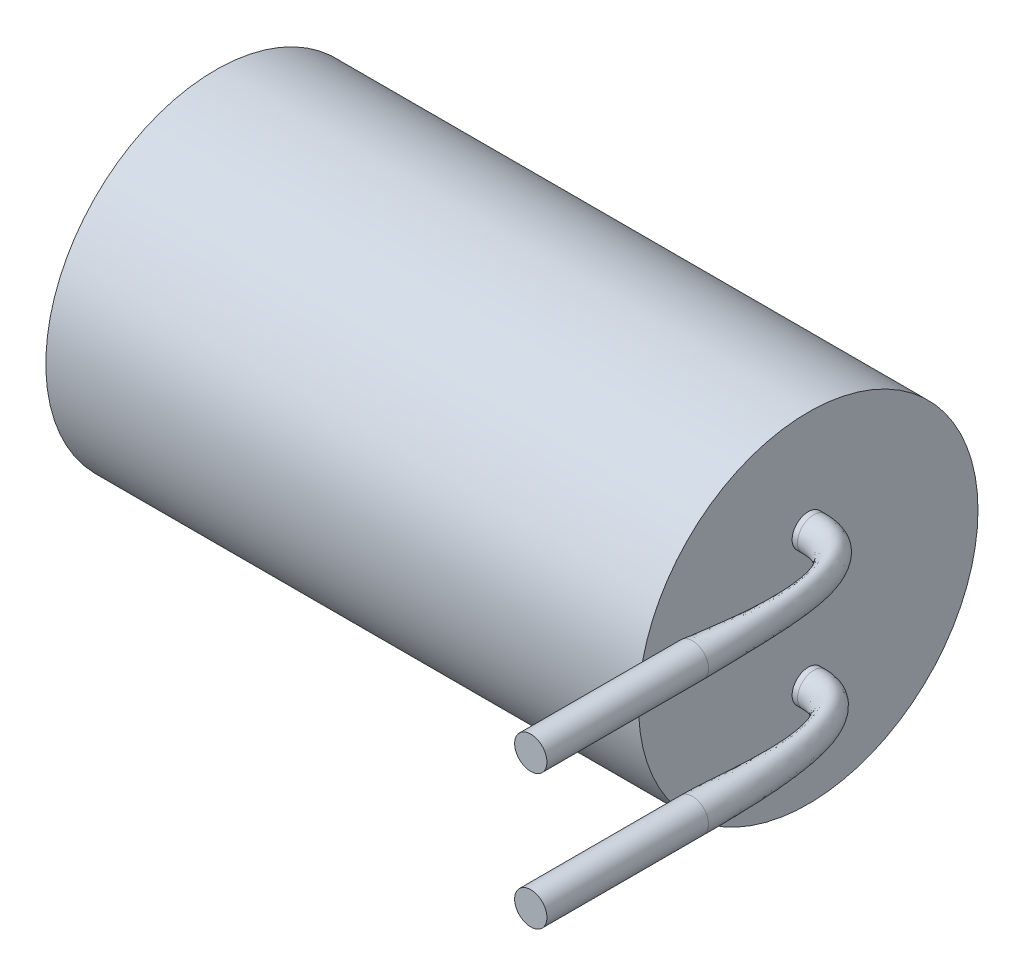
ISO-10303-21;
HEADER;
FILE_DESCRIPTION(('STEP AP214'),'2;1');
FILE_NAME('part.step','',(''),(''),'','','');
FILE_SCHEMA(('AUTOMOTIVE_DESIGN { 1 0 10303 214 1 1 1 1 }'));
ENDSEC;
DATA;
#1=APPLICATION_CONTEXT('core data for automotive mechanical design processes');
#2=APPLICATION_PROTOCOL_DEFINITION('international standard','automotive_design',2000,#1);
#3=PRODUCT_CONTEXT('',#1,'mechanical');
#4=PRODUCT('Part','Part','',(#3));
#5=PRODUCT_RELATED_PRODUCT_CATEGORY('part','',(#4));
#6=PRODUCT_DEFINITION_FORMATION('','',#4);
#7=PRODUCT_DEFINITION_CONTEXT('part definition',#1,'design');
#8=PRODUCT_DEFINITION('design','',#6,#7);
#9=PRODUCT_DEFINITION_SHAPE('','',#8);
#10=(LENGTH_UNIT() NAMED_UNIT(*) SI_UNIT(.MILLI.,.METRE.));
#11=(NAMED_UNIT(*) PLANE_ANGLE_UNIT() SI_UNIT($,.RADIAN.));
#12=(NAMED_UNIT(*) SI_UNIT($,.STERADIAN.) SOLID_ANGLE_UNIT());
#13=UNCERTAINTY_MEASURE_WITH_UNIT(LENGTH_MEASURE(1.E-05),#10,'distance_accuracy_value','');
#14=(GEOMETRIC_REPRESENTATION_CONTEXT(3) GLOBAL_UNCERTAINTY_ASSIGNED_CONTEXT((#13)) GLOBAL_UNIT_ASSIGNED_CONTEXT((#10,
#11,#12)) REPRESENTATION_CONTEXT('',''));
#15=CARTESIAN_POINT('',(0.,0.,0.));
#16=DIRECTION('',(0.,0.,1.));
#17=DIRECTION('',(1.,0.,0.));
#18=AXIS2_PLACEMENT_3D('',#15,#16,#17);
#19=CARTESIAN_POINT('',(1.,-1.25,3.));
#20=DIRECTION('',(0.,0.,-1.));
#21=DIRECTION('',(-1.,0.,0.));
#22=AXIS2_PLACEMENT_3D('',#19,#20,#21);
#23=CYLINDRICAL_SURFACE('',#22,0.3);
#24=CARTESIAN_POINT('',(1.,-1.25,3.));
#25=DIRECTION('',(0.,0.,1.));
#26=DIRECTION('',(1.,0.,0.));
#27=AXIS2_PLACEMENT_3D('',#24,#25,#26);
#28=CIRCLE('',#27,0.3);
#29=CARTESIAN_POINT('',(1.3,-1.25,3.));
#30=VERTEX_POINT('',#29);
#31=EDGE_CURVE('E11',#30,#30,#28,.T.);
#32=ORIENTED_EDGE('',*,*,#31,.F.);
#33=EDGE_LOOP('',(#32));
#34=FACE_BOUND('',#33,.T.);
#35=CARTESIAN_POINT('',(1.,-1.25,0.));
#36=DIRECTION('',(0.,0.,1.));
#37=DIRECTION('',(1.,0.,0.));
#38=AXIS2_PLACEMENT_3D('',#35,#36,#37);
#39=CIRCLE('',#38,0.3);
#40=CARTESIAN_POINT('',(1.3,-1.25,0.));
#41=VERTEX_POINT('',#40);
#42=EDGE_CURVE('E107',#41,#41,#39,.T.);
#43=ORIENTED_EDGE('',*,*,#42,.T.);
#44=EDGE_LOOP('',(#43));
#45=FACE_BOUND('',#44,.T.);
#46=ADVANCED_FACE('F98',(#34,#45),#23,.T.);
#47=CARTESIAN_POINT('',(1.,-1.25,3.));
#48=DIRECTION('',(0.,0.,1.));
#49=DIRECTION('',(1.,0.,0.));
#50=AXIS2_PLACEMENT_3D('',#47,#48,#49);
#51=PLANE('',#50);
#52=ORIENTED_EDGE('',*,*,#31,.T.);
#53=EDGE_LOOP('',(#52));
#54=FACE_BOUND('',#53,.T.);
#55=ADVANCED_FACE('F145',(#54),#51,.T.);
#56=CARTESIAN_POINT('',(1.3,-1.25,0.));
#57=CARTESIAN_POINT('',(1.3,-1.25,-1.20904263540441));
#58=CARTESIAN_POINT('',(1.30904263540441,-1.1200743409328,-3.42040584889376));
#59=CARTESIAN_POINT('',(0.1,-1.1200743409328,-3.42040584889376));
#60=CARTESIAN_POINT('',(1.3,-1.25827872514885,0.));
#61=CARTESIAN_POINT('',(1.3,-1.25827872514885,-1.21017324429423));
#62=CARTESIAN_POINT('',(1.31017324429423,-1.12753639327157,-3.42399124496442));
#63=CARTESIAN_POINT('',(0.1,-1.12753639327157,-3.42399124496442));
#64=CARTESIAN_POINT('',(1.29932787251488,-1.27468043041677,0.));
#65=CARTESIAN_POINT('',(1.29932787251488,-1.27468043041677,-1.21216660423456));
#66=CARTESIAN_POINT('',(1.31216660423456,-1.1426112054141,-3.43048876217637));
#67=CARTESIAN_POINT('',(0.1,-1.1426112054141,-3.43048876217637));
#68=CARTESIAN_POINT('',(1.29638075620017,-1.29873829586105,0.));
#69=CARTESIAN_POINT('',(1.29638075620017,-1.29873829586105,-1.21429572877762));
#70=CARTESIAN_POINT('',(1.31429572877762,-1.16557218393933,-3.43825148395879));
#71=CARTESIAN_POINT('',(0.1,-1.16557218393933,-3.43825148395879));
#72=CARTESIAN_POINT('',(1.29157217216671,-1.32217401147941,0.));
#73=CARTESIAN_POINT('',(1.29157217216671,-1.32217401147941,-1.2155996269445));
#74=CARTESIAN_POINT('',(1.3155996269445,-1.18877856069247,-3.4440669224584));
#75=CARTESIAN_POINT('',(0.1,-1.18877856069247,-3.4440669224584));
#76=CARTESIAN_POINT('',(1.25201660586331,-1.45859066202431,0.));
#77=CARTESIAN_POINT('',(1.25201660586331,-1.45859066202431,-1.2187399492743));
#78=CARTESIAN_POINT('',(1.3187399492743,-1.32886903807775,-3.46749347827521));
#79=CARTESIAN_POINT('',(0.1,-1.32886903807775,-3.46749347827521));
#80=CARTESIAN_POINT('',(1.13245960238154,-1.55,0.));
#81=CARTESIAN_POINT('',(1.13245960238154,-1.55,-1.18015649303907));
#82=CARTESIAN_POINT('',(1.28015649303907,-1.46303951176308,-3.39931849648757));
#83=CARTESIAN_POINT('',(0.1,-1.46303951176308,-3.39931849648757));
#84=CARTESIAN_POINT('',(0.83442549702307,-1.55,0.));
#85=CARTESIAN_POINT('',(0.83442549702307,-1.55,-1.07577348000903));
#86=CARTESIAN_POINT('',(1.17577348000903,-1.5921137703071,-3.13068461229174));
#87=CARTESIAN_POINT('',(0.1,-1.5921137703071,-3.13068461229174));
#88=CARTESIAN_POINT('',(0.7,-1.41557450297693,0.));
#89=CARTESIAN_POINT('',(0.7,-1.41557450297693,-1.00203509053799));
#90=CARTESIAN_POINT('',(1.10203509053799,-1.52916670584266,-2.95130207251958));
#91=CARTESIAN_POINT('',(0.1,-1.52916670584266,-2.95130207251958));
#92=CARTESIAN_POINT('',(0.7,-1.08442549702307,0.));
#93=CARTESIAN_POINT('',(0.7,-1.08442549702307,-0.960836179590925));
#94=CARTESIAN_POINT('',(1.06083617959093,-1.23068461229174,-2.8078862296929));
#95=CARTESIAN_POINT('',(0.1,-1.23068461229174,-2.8078862296929));
#96=CARTESIAN_POINT('',(0.83442549702307,-0.95,0.));
#97=CARTESIAN_POINT('',(0.83442549702307,-0.95,-0.993375658114906));
#98=CARTESIAN_POINT('',(1.09337565811491,-1.05130207251958,-2.87083329415734));
#99=CARTESIAN_POINT('',(0.1,-1.05130207251958,-2.87083329415734));
#100=CARTESIAN_POINT('',(1.13245960238154,-0.95,0.));
#101=CARTESIAN_POINT('',(1.13245960238154,-0.95,-1.09617782545844));
#102=CARTESIAN_POINT('',(1.19617782545844,-0.922227813975571,-3.13946717835317));
#103=CARTESIAN_POINT('',(0.1,-0.922227813975571,-3.13946717835317));
#104=CARTESIAN_POINT('',(1.25201660586331,-1.04140933797569,0.));
#105=CARTESIAN_POINT('',(1.25201660586331,-1.04140933797569,-1.16143282230414));
#106=CARTESIAN_POINT('',(1.26143282230414,-0.952841471171118,-3.28681828335006));
#107=CARTESIAN_POINT('',(0.1,-0.952841471171117,-3.28681828335006));
#108=CARTESIAN_POINT('',(1.29157217216671,-1.17782598852059,0.));
#109=CARTESIAN_POINT('',(1.29157217216671,-1.17782598852059,-1.19577122545962));
#110=CARTESIAN_POINT('',(1.29577122545962,-1.05867006174476,-3.3815518823985));
#111=CARTESIAN_POINT('',(0.1,-1.05867006174476,-3.3815518823985));
#112=CARTESIAN_POINT('',(1.29638075620017,-1.20126170413895,0.));
#113=CARTESIAN_POINT('',(1.29638075620017,-1.20126170413895,-1.20091129657596));
#114=CARTESIAN_POINT('',(1.30091129657596,-1.07771138216639,-3.3960357825484));
#115=CARTESIAN_POINT('',(0.1,-1.07771138216639,-3.3960357825484));
#116=CARTESIAN_POINT('',(1.29932787251488,-1.22531956958323,0.));
#117=CARTESIAN_POINT('',(1.29932787251488,-1.22531956958323,-1.20538295089563));
#118=CARTESIAN_POINT('',(1.30538295089563,-1.09811965382803,-3.40911128758996));
#119=CARTESIAN_POINT('',(0.1,-1.09811965382803,-3.40911128758996));
#120=CARTESIAN_POINT('',(1.3,-1.24172127485115,0.));
#121=CARTESIAN_POINT('',(1.3,-1.24172127485115,-1.20791202651458));
#122=CARTESIAN_POINT('',(1.30791202651458,-1.11261228859402,-3.41682045282309));
#123=CARTESIAN_POINT('',(0.1,-1.11261228859402,-3.41682045282309));
#124=CARTESIAN_POINT('',(1.3,-1.25,0.));
#125=CARTESIAN_POINT('',(1.3,-1.25,-1.20904263540441));
#126=CARTESIAN_POINT('',(1.30904263540441,-1.1200743409328,-3.42040584889376));
#127=CARTESIAN_POINT('',(0.1,-1.1200743409328,-3.42040584889376));
#128=B_SPLINE_SURFACE_WITH_KNOTS('',3,3,((#56,#57,#58,#59),(#60,#61,#62,#63),(#64,#65,#66,#67),
(#68,#69,#70,#71),(#72,#73,#74,#75),(#76,#77,#78,#79),(#80,#81,#82,#83),(#84,#85,#86,#87),(#88,
#89,#90,#91),(#92,#93,#94,#95),(#96,#97,#98,#99),(#100,#101,#102,#103),(#104,#105,#106,#107),
(#108,#109,#110,#111),(#112,#113,#114,#115),(#116,#117,#118,#119),(#120,#121,#122,#123),(#124,
#125,#126,#127)),.UNSPECIFIED.,.T.,.F.,.F.,(4,1,1,1,1,2,2,2,1,1,1,1,4),(4,4),(0.,0.0125,
0.0249999999999999,0.0375000000000001,0.05,0.25,0.5,0.75,0.95,0.9625,0.975,0.9875,1.),(0.,1.),.UNSPECIFIED.);
#129=CARTESIAN_POINT('',(0.1,-1.1200743409328,-3.42040584889376));
#130=CARTESIAN_POINT('',(0.1,-1.11261228859402,-3.41682045282309));
#131=CARTESIAN_POINT('',(0.1,-1.09811965382803,-3.40911128758996));
#132=CARTESIAN_POINT('',(0.1,-1.07771138216639,-3.3960357825484));
#133=CARTESIAN_POINT('',(0.1,-1.05867006174476,-3.3815518823985));
#134=CARTESIAN_POINT('',(0.1,-0.952841471171117,-3.28681828335006));
#135=CARTESIAN_POINT('',(0.1,-0.922227813975571,-3.13946717835317));
#136=CARTESIAN_POINT('',(0.1,-1.05130207251958,-2.87083329415734));
#137=CARTESIAN_POINT('',(0.1,-1.23068461229174,-2.8078862296929));
#138=CARTESIAN_POINT('',(0.1,-1.52916670584266,-2.95130207251958));
#139=CARTESIAN_POINT('',(0.1,-1.5921137703071,-3.13068461229174));
#140=CARTESIAN_POINT('',(0.1,-1.46303951176308,-3.39931849648757));
#141=CARTESIAN_POINT('',(0.1,-1.32886903807775,-3.46749347827521));
#142=CARTESIAN_POINT('',(0.1,-1.18877856069247,-3.4440669224584));
#143=CARTESIAN_POINT('',(0.1,-1.16557218393933,-3.43825148395879));
#144=CARTESIAN_POINT('',(0.1,-1.1426112054141,-3.43048876217637));
#145=CARTESIAN_POINT('',(0.1,-1.12753639327157,-3.42399124496442));
#146=CARTESIAN_POINT('',(0.1,-1.1200743409328,-3.42040584889376));
#147=B_SPLINE_CURVE_WITH_KNOTS('',3,(#129,#130,#131,#132,#133,#134,#135,#136,#137,#138,#139,
#140,#141,#142,#143,#144,#145,#146),.UNSPECIFIED.,.T.,.F.,(4,1,1,1,1,2,2,2,1,1,1,1,4),(0.,
0.0125,0.025,0.0375,0.05,0.25,0.5,0.75,0.95,0.9625,0.975,0.9875,1.),.UNSPECIFIED.);
#148=CARTESIAN_POINT('',(0.1,-1.1200743409328,-3.42040584889376));
#149=VERTEX_POINT('',#148);
#150=EDGE_CURVE('E319',#149,#149,#147,.T.);
#151=ORIENTED_EDGE('',*,*,#42,.F.);
#152=EDGE_LOOP('',(#151));
#153=FACE_BOUND('',#152,.T.);
#154=ORIENTED_EDGE('',*,*,#150,.T.);
#155=EDGE_LOOP('',(#154));
#156=FACE_BOUND('',#155,.T.);
#157=ADVANCED_FACE('F120',(#153,#156),#128,.T.);
#158=CARTESIAN_POINT('',(1.,1.25,3.));
#159=DIRECTION('',(0.,0.,-1.));
#160=DIRECTION('',(-1.,0.,0.));
#161=AXIS2_PLACEMENT_3D('',#158,#159,#160);
#162=CYLINDRICAL_SURFACE('',#161,0.3);
#163=CARTESIAN_POINT('',(1.,1.25,3.));
#164=DIRECTION('',(0.,0.,1.));
#165=DIRECTION('',(1.,0.,0.));
#166=AXIS2_PLACEMENT_3D('',#163,#164,#165);
#167=CIRCLE('',#166,0.3);
#168=CARTESIAN_POINT('',(1.3,1.25,3.));
#169=VERTEX_POINT('',#168);
#170=EDGE_CURVE('E112',#169,#169,#167,.T.);
#171=ORIENTED_EDGE('',*,*,#170,.F.);
#172=EDGE_LOOP('',(#171));
#173=FACE_BOUND('',#172,.T.);
#174=CARTESIAN_POINT('',(1.,1.25,0.));
#175=DIRECTION('',(0.,0.,1.));
#176=DIRECTION('',(1.,0.,0.));
#177=AXIS2_PLACEMENT_3D('',#174,#175,#176);
#178=CIRCLE('',#177,0.3);
#179=CARTESIAN_POINT('',(1.3,1.25,0.));
#180=VERTEX_POINT('',#179);
#181=EDGE_CURVE('E276',#180,#180,#178,.T.);
#182=ORIENTED_EDGE('',*,*,#181,.T.);
#183=EDGE_LOOP('',(#182));
#184=FACE_BOUND('',#183,.T.);
#185=ADVANCED_FACE('F144',(#173,#184),#162,.T.);
#186=CARTESIAN_POINT('',(1.,1.25,3.));
#187=DIRECTION('',(0.,0.,1.));
#188=DIRECTION('',(1.,0.,0.));
#189=AXIS2_PLACEMENT_3D('',#186,#187,#188);
#190=PLANE('',#189);
#191=ORIENTED_EDGE('',*,*,#170,.T.);
#192=EDGE_LOOP('',(#191));
#193=FACE_BOUND('',#192,.T.);
#194=ADVANCED_FACE('F186',(#193),#190,.T.);
#195=CARTESIAN_POINT('',(1.29437425540126,1.19217441952774,0.));
#196=CARTESIAN_POINT('',(1.30196465047499,1.28496440040173,-1.71071921203799));
#197=CARTESIAN_POINT('',(1.30955504554872,1.37775438127573,-3.42143842407599));
#198=CARTESIAN_POINT('',(0.1,1.37775438127573,-3.42143842407599));
#199=CARTESIAN_POINT('',(1.29277851511025,1.1840509410232,0.));
#200=CARTESIAN_POINT('',(1.30163610883362,1.27715738763653,-1.71248195105323));
#201=CARTESIAN_POINT('',(1.31049370255698,1.37026383424986,-3.42496390210646));
#202=CARTESIAN_POINT('',(0.1,1.37026383424986,-3.42496390210646));
#203=CARTESIAN_POINT('',(1.28895753125752,1.16808636231127,0.));
#204=CARTESIAN_POINT('',(1.300529818315,1.26161189784543,-1.71567019852495));
#205=CARTESIAN_POINT('',(1.31210210537248,1.35513743337958,-3.43134039704991));
#206=CARTESIAN_POINT('',(0.1,1.35513743337958,-3.43134039704991));
#207=CARTESIAN_POINT('',(1.28142848057431,1.14504770392765,0.));
#208=CARTESIAN_POINT('',(1.29754806160013,1.23858134181335,-1.71945942703597));
#209=CARTESIAN_POINT('',(1.31366764262594,1.33211497969905,-3.43891885407195));
#210=CARTESIAN_POINT('',(0.1,1.33211497969905,-3.43891885407195));
#211=CARTESIAN_POINT('',(1.27219278989498,1.1229783300211,0.));
#212=CARTESIAN_POINT('',(1.29330744012777,1.21592053587249,-1.72227406183014));
#213=CARTESIAN_POINT('',(1.31442209036056,1.30886274172388,-3.44454812366028));
#214=CARTESIAN_POINT('',(0.1,1.30886274172388,-3.44454812366028));
#215=CARTESIAN_POINT('',(1.20708441529039,0.996744242200809,0.));
#216=CARTESIAN_POINT('',(1.26072187679987,1.08266662939445,-1.73342560217221));
#217=CARTESIAN_POINT('',(1.31435933830936,1.1685890165881,-3.46685120434442));
#218=CARTESIAN_POINT('',(0.1,1.1685890165881,-3.46685120434442));
#219=CARTESIAN_POINT('',(1.07215007560045,0.930093899942615,0.));
#220=CARTESIAN_POINT('',(1.17314191698645,0.982531562177119,-1.69880156684483));
#221=CARTESIAN_POINT('',(1.27413375837245,1.03496922441162,-3.39760313368966));
#222=CARTESIAN_POINT('',(0.1,1.03496922441162,-3.39760313368966));
#223=CARTESIAN_POINT('',(0.779704849436849,0.987540550418896,0.));
#224=CARTESIAN_POINT('',(0.975129724548882,0.947796282866697,-1.56397172037916));
#225=CARTESIAN_POINT('',(1.17055459966091,0.908052015314499,-3.12794344075832));
#226=CARTESIAN_POINT('',(0.1,0.908052015314499,-3.12794344075832));
#227=CARTESIAN_POINT('',(0.673710938778584,1.14535601038137,0.));
#228=CARTESIAN_POINT('',(0.886973427331586,1.05889534429411,-1.47453556826676));
#229=CARTESIAN_POINT('',(1.10023591588459,0.972434678206862,-2.94907113653353));
#230=CARTESIAN_POINT('',(0.1,0.972434678206862,-2.94907113653353));
#231=CARTESIAN_POINT('',(0.737540550418895,1.47029515056315,0.));
#232=CARTESIAN_POINT('',(0.901128735480577,1.37117585490242,-1.40402600765725));
#233=CARTESIAN_POINT('',(1.06471692054226,1.27205655924168,-2.8080520153145));
#234=CARTESIAN_POINT('',(0.1,1.27205655924168,-2.8080520153145));
#235=CARTESIAN_POINT('',(0.895356010381367,1.57628906122142,0.));
#236=CARTESIAN_POINT('',(0.997436309678811,1.51360896234394,-1.43621733910343));
#237=CARTESIAN_POINT('',(1.09951660897626,1.45092886346647,-2.87243467820686));
#238=CARTESIAN_POINT('',(0.1,1.45092886346647,-2.87243467820686));
#239=CARTESIAN_POINT('',(1.18780123654497,1.51884241074514,0.));
#240=CARTESIAN_POINT('',(1.19523707786769,1.54834424165437,-1.5710471855691));
#241=CARTESIAN_POINT('',(1.2026729191904,1.5778460725636,-3.1420943711382));
#242=CARTESIAN_POINT('',(0.1,1.5778460725636,-3.1420943711382));
#243=CARTESIAN_POINT('',(1.28749692270804,1.40610238098123,0.));
#244=CARTESIAN_POINT('',(1.27709445872267,1.47607743404082,-1.64459769894951));
#245=CARTESIAN_POINT('',(1.26669199473731,1.54605248710041,-3.28919539789902));
#246=CARTESIAN_POINT('',(0.1,1.54605248710041,-3.28919539789902));
#247=CARTESIAN_POINT('',(1.30001615062037,1.26461946927825,0.));
#248=CARTESIAN_POINT('',(1.29898162771683,1.35204377195178,-1.69153890789434));
#249=CARTESIAN_POINT('',(1.29794710481329,1.4394680746253,-3.38307781578868));
#250=CARTESIAN_POINT('',(0.1,1.4394680746253,-3.38307781578868));
#251=CARTESIAN_POINT('',(1.30021728223693,1.24069636761847,0.));
#252=CARTESIAN_POINT('',(1.30138506306034,1.33050382772766,-1.6987043242621));
#253=CARTESIAN_POINT('',(1.30255284388374,1.42031128783686,-3.39740864852421));
#254=CARTESIAN_POINT('',(0.1,1.42031128783686,-3.39740864852421));
#255=CARTESIAN_POINT('',(1.29847193269189,1.21652158449073,0.));
#256=CARTESIAN_POINT('',(1.3024710480074,1.30816023272797,-1.70516008813324));
#257=CARTESIAN_POINT('',(1.30647016332291,1.39979888096522,-3.41032017626648));
#258=CARTESIAN_POINT('',(0.1,1.39979888096522,-3.41032017626648));
#259=CARTESIAN_POINT('',(1.29596999569227,1.20029789803229,0.));
#260=CARTESIAN_POINT('',(1.30229319211636,1.29277141316694,-1.70895647302276));
#261=CARTESIAN_POINT('',(1.30861638854046,1.3852449283016,-3.41791294604551));
#262=CARTESIAN_POINT('',(0.1,1.3852449283016,-3.41791294604551));
#263=CARTESIAN_POINT('',(1.29437425540126,1.19217441952774,0.));
#264=CARTESIAN_POINT('',(1.30196465047499,1.28496440040173,-1.71071921203799));
#265=CARTESIAN_POINT('',(1.30955504554872,1.37775438127573,-3.42143842407599));
#266=CARTESIAN_POINT('',(0.1,1.37775438127573,-3.42143842407599));
#267=B_SPLINE_SURFACE_WITH_KNOTS('',3,3,((#195,#196,#197,#198),(#199,#200,#201,#202),(#203,#204,
#205,#206),(#207,#208,#209,#210),(#211,#212,#213,#214),(#215,#216,#217,#218),(#219,#220,#221,
#222),(#223,#224,#225,#226),(#227,#228,#229,#230),(#231,#232,#233,#234),(#235,#236,#237,#238),
(#239,#240,#241,#242),(#243,#244,#245,#246),(#247,#248,#249,#250),(#251,#252,#253,#254),(#255,
#256,#257,#258),(#259,#260,#261,#262),(#263,#264,#265,#266)),.UNSPECIFIED.,.T.,.F.,.F.,(4,1,1,1,
1,2,2,2,1,1,1,1,4),(4,4),(0.,0.0125,0.0249999999999999,0.0375000000000001,0.05,0.25,0.5,0.75,
0.95,0.9625,0.975,0.9875,1.),(0.,1.),.UNSPECIFIED.);
#268=CARTESIAN_POINT('',(0.1,1.37775438127573,-3.42143842407599));
#269=CARTESIAN_POINT('',(0.1,1.3852449283016,-3.41791294604551));
#270=CARTESIAN_POINT('',(0.1,1.39979888096522,-3.41032017626648));
#271=CARTESIAN_POINT('',(0.1,1.42031128783686,-3.39740864852421));
#272=CARTESIAN_POINT('',(0.1,1.4394680746253,-3.38307781578868));
#273=CARTESIAN_POINT('',(0.1,1.54605248710041,-3.28919539789902));
#274=CARTESIAN_POINT('',(0.1,1.5778460725636,-3.1420943711382));
#275=CARTESIAN_POINT('',(0.1,1.45092886346647,-2.87243467820686));
#276=CARTESIAN_POINT('',(0.1,1.27205655924168,-2.8080520153145));
#277=CARTESIAN_POINT('',(0.1,0.972434678206862,-2.94907113653353));
#278=CARTESIAN_POINT('',(0.1,0.908052015314499,-3.12794344075832));
#279=CARTESIAN_POINT('',(0.1,1.03496922441162,-3.39760313368966));
#280=CARTESIAN_POINT('',(0.1,1.1685890165881,-3.46685120434442));
#281=CARTESIAN_POINT('',(0.1,1.30886274172388,-3.44454812366028));
#282=CARTESIAN_POINT('',(0.1,1.33211497969905,-3.43891885407195));
#283=CARTESIAN_POINT('',(0.1,1.35513743337958,-3.43134039704991));
#284=CARTESIAN_POINT('',(0.1,1.37026383424986,-3.42496390210646));
#285=CARTESIAN_POINT('',(0.1,1.37775438127573,-3.42143842407599));
#286=B_SPLINE_CURVE_WITH_KNOTS('',3,(#268,#269,#270,#271,#272,#273,#274,#275,#276,#277,#278,
#279,#280,#281,#282,#283,#284,#285),.UNSPECIFIED.,.T.,.F.,(4,1,1,1,1,2,2,2,1,1,1,1,4),(0.,
0.0125,0.025,0.0375,0.05,0.25,0.5,0.75,0.95,0.9625,0.975,0.9875,1.),.UNSPECIFIED.);
#287=CARTESIAN_POINT('',(0.1,1.37775438127573,-3.42143842407599));
#288=VERTEX_POINT('',#287);
#289=EDGE_CURVE('E323',#288,#288,#286,.T.);
#290=ORIENTED_EDGE('',*,*,#181,.F.);
#291=EDGE_LOOP('',(#290));
#292=FACE_BOUND('',#291,.T.);
#293=ORIENTED_EDGE('',*,*,#289,.T.);
#294=EDGE_LOOP('',(#293));
#295=FACE_BOUND('',#294,.T.);
#296=ADVANCED_FACE('F195',(#292,#295),#267,.T.);
#297=CARTESIAN_POINT('',(-11.,0.,-3.15));
#298=DIRECTION('',(1.,0.,0.));
#299=DIRECTION('',(0.,0.,-1.));
#300=AXIS2_PLACEMENT_3D('',#297,#298,#299);
#301=CYLINDRICAL_SURFACE('',#300,3.15);
#302=CARTESIAN_POINT('',(-11.,0.,-3.15));
#303=DIRECTION('',(1.,0.,0.));
#304=DIRECTION('',(0.,0.,-1.));
#305=AXIS2_PLACEMENT_3D('',#302,#303,#304);
#306=CIRCLE('',#305,3.15);
#307=CARTESIAN_POINT('',(-11.,0.,-6.3));
#308=VERTEX_POINT('',#307);
#309=EDGE_CURVE('E305',#308,#308,#306,.T.);
#310=ORIENTED_EDGE('',*,*,#309,.T.);
#311=EDGE_LOOP('',(#310));
#312=FACE_BOUND('',#311,.T.);
#313=CARTESIAN_POINT('',(0.,0.,-3.15));
#314=DIRECTION('',(1.,0.,0.));
#315=DIRECTION('',(0.,0.,-1.));
#316=AXIS2_PLACEMENT_3D('',#313,#314,#315);
#317=CIRCLE('',#316,3.15);
#318=CARTESIAN_POINT('',(0.,0.,-6.3));
#319=VERTEX_POINT('',#318);
#320=EDGE_CURVE('E330',#319,#319,#317,.T.);
#321=ORIENTED_EDGE('',*,*,#320,.F.);
#322=EDGE_LOOP('',(#321));
#323=FACE_BOUND('',#322,.T.);
#324=ADVANCED_FACE('F204',(#312,#323),#301,.T.);
#325=CARTESIAN_POINT('',(-11.,0.,-3.15));
#326=DIRECTION('',(1.,0.,0.));
#327=DIRECTION('',(0.,0.,-1.));
#328=AXIS2_PLACEMENT_3D('',#325,#326,#327);
#329=PLANE('',#328);
#330=ORIENTED_EDGE('',*,*,#309,.F.);
#331=EDGE_LOOP('',(#330));
#332=FACE_BOUND('',#331,.T.);
#333=ADVANCED_FACE('F215',(#332),#329,.F.);
#334=CARTESIAN_POINT('',(0.,0.,-3.15));
#335=DIRECTION('',(1.,0.,0.));
#336=DIRECTION('',(0.,0.,-1.));
#337=AXIS2_PLACEMENT_3D('',#334,#335,#336);
#338=PLANE('',#337);
#339=CARTESIAN_POINT('',(0.,-1.25,-3.15));
#340=DIRECTION('',(1.,0.,0.));
#341=DIRECTION('',(0.,0.,-1.));
#342=AXIS2_PLACEMENT_3D('',#339,#340,#341);
#343=CIRCLE('',#342,0.3);
#344=CARTESIAN_POINT('',(0.,-1.25,-3.45));
#345=VERTEX_POINT('',#344);
#346=EDGE_CURVE('E321',#345,#345,#343,.T.);
#347=ORIENTED_EDGE('',*,*,#346,.F.);
#348=EDGE_LOOP('',(#347));
#349=FACE_BOUND('',#348,.T.);
#350=CARTESIAN_POINT('',(0.,1.25,-3.15));
#351=DIRECTION('',(1.,0.,0.));
#352=DIRECTION('',(0.,0.,-1.));
#353=AXIS2_PLACEMENT_3D('',#350,#351,#352);
#354=CIRCLE('',#353,0.3);
#355=CARTESIAN_POINT('',(0.,1.25,-3.45));
#356=VERTEX_POINT('',#355);
#357=EDGE_CURVE('E320',#356,#356,#354,.T.);
#358=ORIENTED_EDGE('',*,*,#357,.F.);
#359=EDGE_LOOP('',(#358));
#360=FACE_BOUND('',#359,.T.);
#361=ORIENTED_EDGE('',*,*,#320,.T.);
#362=EDGE_LOOP('',(#361));
#363=FACE_BOUND('',#362,.T.);
#364=ADVANCED_FACE('F225',(#349,#360,#363),#338,.T.);
#365=CARTESIAN_POINT('',(0.1,1.25,-3.15));
#366=DIRECTION('',(-1.,0.,0.));
#367=DIRECTION('',(0.,0.,1.));
#368=AXIS2_PLACEMENT_3D('',#365,#366,#367);
#369=CYLINDRICAL_SURFACE('',#368,0.3);
#370=ORIENTED_EDGE('',*,*,#289,.F.);
#371=EDGE_LOOP('',(#370));
#372=FACE_BOUND('',#371,.T.);
#373=ORIENTED_EDGE('',*,*,#357,.T.);
#374=EDGE_LOOP('',(#373));
#375=FACE_BOUND('',#374,.T.);
#376=ADVANCED_FACE('F235',(#372,#375),#369,.T.);
#377=CARTESIAN_POINT('',(0.1,-1.25,-3.15));
#378=DIRECTION('',(-1.,0.,0.));
#379=DIRECTION('',(0.,0.,1.));
#380=AXIS2_PLACEMENT_3D('',#377,#378,#379);
#381=CYLINDRICAL_SURFACE('',#380,0.3);
#382=ORIENTED_EDGE('',*,*,#150,.F.);
#383=EDGE_LOOP('',(#382));
#384=FACE_BOUND('',#383,.T.);
#385=ORIENTED_EDGE('',*,*,#346,.T.);
#386=EDGE_LOOP('',(#385));
#387=FACE_BOUND('',#386,.T.);
#388=ADVANCED_FACE('F245',(#384,#387),#381,.T.);
#389=CLOSED_SHELL('',(#46,#55,#157,#185,#194,#296,#324,#333,#364,#376,#388));
#390=MANIFOLD_SOLID_BREP('B2',#389);
#391=ADVANCED_BREP_SHAPE_REPRESENTATION('',(#18,#390),#14);
#392=SHAPE_DEFINITION_REPRESENTATION(#9,#391);
ENDSEC;
END-ISO-10303-21;
